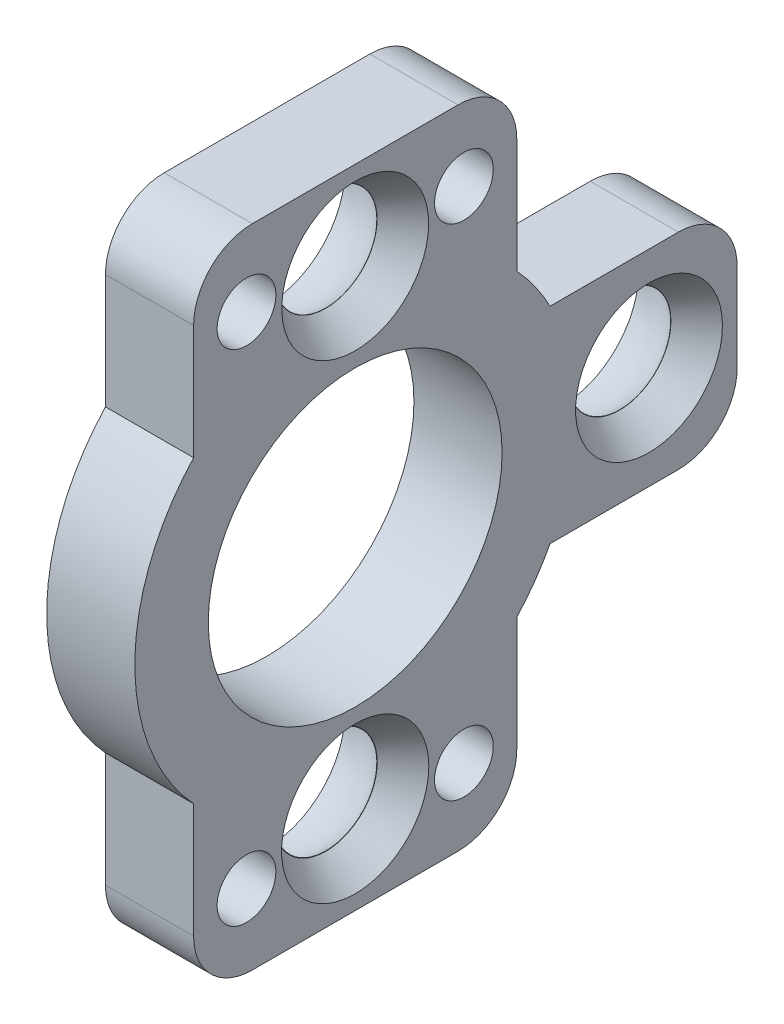
ISO-10303-21;
HEADER;
FILE_DESCRIPTION(('STEP AP214'),'2;1');
FILE_NAME('part.step','',(''),(''),'','','');
FILE_SCHEMA(('AUTOMOTIVE_DESIGN { 1 0 10303 214 1 1 1 1 }'));
ENDSEC;
DATA;
#1=APPLICATION_CONTEXT('core data for automotive mechanical design processes');
#2=APPLICATION_PROTOCOL_DEFINITION('international standard','automotive_design',2000,#1);
#3=PRODUCT_CONTEXT('',#1,'mechanical');
#4=PRODUCT('Part','Part','',(#3));
#5=PRODUCT_RELATED_PRODUCT_CATEGORY('part','',(#4));
#6=PRODUCT_DEFINITION_FORMATION('','',#4);
#7=PRODUCT_DEFINITION_CONTEXT('part definition',#1,'design');
#8=PRODUCT_DEFINITION('design','',#6,#7);
#9=PRODUCT_DEFINITION_SHAPE('','',#8);
#10=(LENGTH_UNIT() NAMED_UNIT(*) SI_UNIT(.MILLI.,.METRE.));
#11=(NAMED_UNIT(*) PLANE_ANGLE_UNIT() SI_UNIT($,.RADIAN.));
#12=(NAMED_UNIT(*) SI_UNIT($,.STERADIAN.) SOLID_ANGLE_UNIT());
#13=UNCERTAINTY_MEASURE_WITH_UNIT(LENGTH_MEASURE(1.E-05),#10,'distance_accuracy_value','');
#14=(GEOMETRIC_REPRESENTATION_CONTEXT(3) GLOBAL_UNCERTAINTY_ASSIGNED_CONTEXT((#13)) GLOBAL_UNIT_ASSIGNED_CONTEXT((#10,
#11,#12)) REPRESENTATION_CONTEXT('',''));
#15=CARTESIAN_POINT('',(0.,0.,0.));
#16=DIRECTION('',(0.,0.,1.));
#17=DIRECTION('',(1.,0.,0.));
#18=AXIS2_PLACEMENT_3D('',#15,#16,#17);
#19=CARTESIAN_POINT('',(0.,0.,-10.));
#20=DIRECTION('',(0.,0.,1.));
#21=DIRECTION('',(0.,-1.,0.));
#22=AXIS2_PLACEMENT_3D('',#19,#20,#21);
#23=SPHERICAL_SURFACE('',#22,2.65);
#24=CARTESIAN_POINT('',(0.,0.,-10.));
#25=DIRECTION('',(1.,0.,0.));
#26=DIRECTION('',(0.,0.,-1.));
#27=AXIS2_PLACEMENT_3D('',#24,#25,#26);
#28=SPHERICAL_SURFACE('',#27,2.65);
#29=CARTESIAN_POINT('',(0.,0.,-10.));
#30=DIRECTION('',(1.,0.,0.));
#31=DIRECTION('',(0.,0.,-1.));
#32=AXIS2_PLACEMENT_3D('',#29,#30,#31);
#33=CIRCLE('',#32,2.65);
#34=CARTESIAN_POINT('',(0.,0.,-12.65));
#35=VERTEX_POINT('',#34);
#36=EDGE_CURVE('E190',#35,#35,#33,.T.);
#37=ORIENTED_EDGE('',*,*,#36,.F.);
#38=EDGE_LOOP('',(#37));
#39=FACE_BOUND('',#38,.T.);
#40=CARTESIAN_POINT('',(2.,0.,-10.));
#41=DIRECTION('',(1.,0.,0.));
#42=DIRECTION('',(0.,0.,-1.));
#43=AXIS2_PLACEMENT_3D('',#40,#41,#42);
#44=CIRCLE('',#43,1.73853386507137);
#45=CARTESIAN_POINT('',(2.,0.,-11.7385338650714));
#46=VERTEX_POINT('',#45);
#47=EDGE_CURVE('E196',#46,#46,#44,.F.);
#48=ORIENTED_EDGE('',*,*,#47,.F.);
#49=EDGE_LOOP('',(#48));
#50=FACE_BOUND('',#49,.T.);
#51=ADVANCED_FACE('F35',(#39,#50),#28,.F.);
#52=CARTESIAN_POINT('',(3.,0.,0.));
#53=DIRECTION('',(-1.,0.,0.));
#54=DIRECTION('',(0.,0.,1.));
#55=AXIS2_PLACEMENT_3D('',#52,#53,#54);
#56=CYLINDRICAL_SURFACE('',#55,7.5);
#57=CARTESIAN_POINT('',(0.,0.,0.));
#58=DIRECTION('',(1.,0.,0.));
#59=DIRECTION('',(0.,0.,-1.));
#60=AXIS2_PLACEMENT_3D('',#57,#58,#59);
#61=CIRCLE('',#60,7.5);
#62=CARTESIAN_POINT('',(0.,-5.09901951359278,-5.5));
#63=VERTEX_POINT('',#62);
#64=CARTESIAN_POINT('',(0.,-3.5,-6.6332495807108));
#65=VERTEX_POINT('',#64);
#66=EDGE_CURVE('E171',#63,#65,#61,.T.);
#67=ORIENTED_EDGE('',*,*,#66,.T.);
#68=DIRECTION('',(-1.,0.,0.));
#69=VECTOR('',#68,1.);
#70=CARTESIAN_POINT('',(3.,-3.5,-6.6332495807108));
#71=LINE('',#70,#69);
#72=CARTESIAN_POINT('',(3.,-3.5,-6.6332495807108));
#73=VERTEX_POINT('',#72);
#74=EDGE_CURVE('E182',#65,#73,#71,.F.);
#75=ORIENTED_EDGE('',*,*,#74,.T.);
#76=CARTESIAN_POINT('',(3.,0.,0.));
#77=DIRECTION('',(1.,0.,0.));
#78=DIRECTION('',(0.,0.,-1.));
#79=AXIS2_PLACEMENT_3D('',#76,#77,#78);
#80=CIRCLE('',#79,7.5);
#81=CARTESIAN_POINT('',(3.,-5.09901951359278,-5.5));
#82=VERTEX_POINT('',#81);
#83=EDGE_CURVE('E282',#82,#73,#80,.T.);
#84=ORIENTED_EDGE('',*,*,#83,.F.);
#85=DIRECTION('',(-1.,0.,0.));
#86=VECTOR('',#85,1.);
#87=CARTESIAN_POINT('',(3.,-5.09901951359278,-5.5));
#88=LINE('',#87,#86);
#89=EDGE_CURVE('E292',#82,#63,#88,.T.);
#90=ORIENTED_EDGE('',*,*,#89,.T.);
#91=EDGE_LOOP('',(#67,#75,#84,#90));
#92=FACE_BOUND('',#91,.T.);
#93=ADVANCED_FACE('F373',(#92),#56,.T.);
#94=CARTESIAN_POINT('',(0.,-8.,0.));
#95=DIRECTION('',(0.,0.,1.));
#96=DIRECTION('',(0.,-1.,0.));
#97=AXIS2_PLACEMENT_3D('',#94,#95,#96);
#98=SPHERICAL_SURFACE('',#97,2.65);
#99=CARTESIAN_POINT('',(0.,-8.,0.));
#100=DIRECTION('',(1.,0.,0.));
#101=DIRECTION('',(0.,0.,-1.));
#102=AXIS2_PLACEMENT_3D('',#99,#100,#101);
#103=SPHERICAL_SURFACE('',#102,2.65);
#104=CARTESIAN_POINT('',(0.,-8.,0.));
#105=DIRECTION('',(1.,0.,0.));
#106=DIRECTION('',(0.,0.,-1.));
#107=AXIS2_PLACEMENT_3D('',#104,#105,#106);
#108=CIRCLE('',#107,2.65);
#109=CARTESIAN_POINT('',(0.,-8.,-2.65));
#110=VERTEX_POINT('',#109);
#111=EDGE_CURVE('E298',#110,#110,#108,.F.);
#112=ORIENTED_EDGE('',*,*,#111,.T.);
#113=EDGE_LOOP('',(#112));
#114=FACE_BOUND('',#113,.T.);
#115=CARTESIAN_POINT('',(2.,-8.,0.));
#116=DIRECTION('',(1.,0.,0.));
#117=DIRECTION('',(0.,0.,-1.));
#118=AXIS2_PLACEMENT_3D('',#115,#116,#117);
#119=CIRCLE('',#118,1.73853386507137);
#120=CARTESIAN_POINT('',(2.,-8.,-1.73853386507137));
#121=VERTEX_POINT('',#120);
#122=EDGE_CURVE('E235',#121,#121,#119,.T.);
#123=ORIENTED_EDGE('',*,*,#122,.T.);
#124=EDGE_LOOP('',(#123));
#125=FACE_BOUND('',#124,.T.);
#126=ADVANCED_FACE('F436',(#114,#125),#103,.F.);
#127=CARTESIAN_POINT('',(0.,8.,0.));
#128=DIRECTION('',(0.,0.,-1.));
#129=DIRECTION('',(0.,1.,0.));
#130=AXIS2_PLACEMENT_3D('',#127,#128,#129);
#131=SPHERICAL_SURFACE('',#130,2.65);
#132=CARTESIAN_POINT('',(0.,8.,0.));
#133=DIRECTION('',(1.,0.,0.));
#134=DIRECTION('',(0.,0.,-1.));
#135=AXIS2_PLACEMENT_3D('',#132,#133,#134);
#136=SPHERICAL_SURFACE('',#135,2.65);
#137=CARTESIAN_POINT('',(0.,8.,0.));
#138=DIRECTION('',(1.,0.,0.));
#139=DIRECTION('',(0.,0.,-1.));
#140=AXIS2_PLACEMENT_3D('',#137,#138,#139);
#141=CIRCLE('',#140,2.65);
#142=CARTESIAN_POINT('',(0.,8.,-2.65));
#143=VERTEX_POINT('',#142);
#144=EDGE_CURVE('E256',#143,#143,#141,.T.);
#145=ORIENTED_EDGE('',*,*,#144,.F.);
#146=EDGE_LOOP('',(#145));
#147=FACE_BOUND('',#146,.T.);
#148=CARTESIAN_POINT('',(2.,8.,0.));
#149=DIRECTION('',(1.,0.,0.));
#150=DIRECTION('',(0.,0.,-1.));
#151=AXIS2_PLACEMENT_3D('',#148,#149,#150);
#152=CIRCLE('',#151,1.73853386507137);
#153=CARTESIAN_POINT('',(2.,8.,-1.73853386507137));
#154=VERTEX_POINT('',#153);
#155=EDGE_CURVE('E242',#154,#154,#152,.F.);
#156=ORIENTED_EDGE('',*,*,#155,.F.);
#157=EDGE_LOOP('',(#156));
#158=FACE_BOUND('',#157,.T.);
#159=ADVANCED_FACE('F485',(#147,#158),#136,.F.);
#160=CARTESIAN_POINT('',(3.,3.5,-6.6332495807108));
#161=VERTEX_POINT('',#160);
#162=CARTESIAN_POINT('',(3.,5.09901951359279,-5.5));
#163=VERTEX_POINT('',#162);
#164=EDGE_CURVE('E178',#161,#163,#80,.T.);
#165=ORIENTED_EDGE('',*,*,#164,.F.);
#166=DIRECTION('',(-1.,0.,0.));
#167=VECTOR('',#166,1.);
#168=CARTESIAN_POINT('',(3.,3.5,-6.6332495807108));
#169=LINE('',#168,#167);
#170=CARTESIAN_POINT('',(0.,3.5,-6.6332495807108));
#171=VERTEX_POINT('',#170);
#172=EDGE_CURVE('E176',#161,#171,#169,.T.);
#173=ORIENTED_EDGE('',*,*,#172,.T.);
#174=CARTESIAN_POINT('',(0.,5.09901951359279,-5.5));
#175=VERTEX_POINT('',#174);
#176=EDGE_CURVE('E160',#171,#175,#61,.T.);
#177=ORIENTED_EDGE('',*,*,#176,.T.);
#178=DIRECTION('',(-1.,0.,0.));
#179=VECTOR('',#178,1.);
#180=CARTESIAN_POINT('',(3.,5.09901951359279,-5.5));
#181=LINE('',#180,#179);
#182=EDGE_CURVE('E281',#175,#163,#181,.F.);
#183=ORIENTED_EDGE('',*,*,#182,.T.);
#184=EDGE_LOOP('',(#165,#173,#177,#183));
#185=FACE_BOUND('',#184,.T.);
#186=ADVANCED_FACE('F177',(#185),#56,.T.);
#187=CARTESIAN_POINT('',(3.,0.,0.));
#188=DIRECTION('',(1.,0.,0.));
#189=DIRECTION('',(0.,0.,-1.));
#190=AXIS2_PLACEMENT_3D('',#187,#188,#189);
#191=PLANE('',#190);
#192=CARTESIAN_POINT('',(3.,0.,-10.));
#193=DIRECTION('',(1.,0.,0.));
#194=DIRECTION('',(0.,0.,-1.));
#195=AXIS2_PLACEMENT_3D('',#192,#193,#194);
#196=CIRCLE('',#195,2.5);
#197=CARTESIAN_POINT('',(3.,0.,-12.5));
#198=VERTEX_POINT('',#197);
#199=EDGE_CURVE('E746',#198,#198,#196,.T.);
#200=ORIENTED_EDGE('',*,*,#199,.F.);
#201=EDGE_LOOP('',(#200));
#202=FACE_BOUND('',#201,.T.);
#203=DIRECTION('',(0.,-1.,0.));
#204=VECTOR('',#203,1.);
#205=CARTESIAN_POINT('',(3.,3.5,-13.));
#206=LINE('',#205,#204);
#207=CARTESIAN_POINT('',(3.,1.5,-13.));
#208=VERTEX_POINT('',#207);
#209=CARTESIAN_POINT('',(3.,-1.5,-13.));
#210=VERTEX_POINT('',#209);
#211=EDGE_CURVE('E356',#208,#210,#206,.T.);
#212=ORIENTED_EDGE('',*,*,#211,.F.);
#213=CARTESIAN_POINT('',(3.,1.5,-11.));
#214=DIRECTION('',(1.,0.,0.));
#215=DIRECTION('',(0.,0.,-1.));
#216=AXIS2_PLACEMENT_3D('',#213,#214,#215);
#217=CIRCLE('',#216,2.);
#218=CARTESIAN_POINT('',(3.,3.5,-11.));
#219=VERTEX_POINT('',#218);
#220=EDGE_CURVE('E43',#208,#219,#217,.T.);
#221=ORIENTED_EDGE('',*,*,#220,.T.);
#222=DIRECTION('',(0.,0.,-1.));
#223=VECTOR('',#222,1.);
#224=CARTESIAN_POINT('',(3.,3.5,-5.5));
#225=LINE('',#224,#223);
#226=EDGE_CURVE('E201',#161,#219,#225,.T.);
#227=ORIENTED_EDGE('',*,*,#226,.F.);
#228=ORIENTED_EDGE('',*,*,#164,.T.);
#229=DIRECTION('',(0.,1.,0.));
#230=VECTOR('',#229,1.);
#231=CARTESIAN_POINT('',(3.,11.,-5.5));
#232=LINE('',#231,#230);
#233=CARTESIAN_POINT('',(3.,9.,-5.5));
#234=VERTEX_POINT('',#233);
#235=EDGE_CURVE('E270',#163,#234,#232,.T.);
#236=ORIENTED_EDGE('',*,*,#235,.T.);
#237=CARTESIAN_POINT('',(3.,9.,-3.5));
#238=DIRECTION('',(1.,0.,0.));
#239=DIRECTION('',(0.,0.,-1.));
#240=AXIS2_PLACEMENT_3D('',#237,#238,#239);
#241=CIRCLE('',#240,2.);
#242=CARTESIAN_POINT('',(3.,11.,-3.5));
#243=VERTEX_POINT('',#242);
#244=EDGE_CURVE('E313',#234,#243,#241,.T.);
#245=ORIENTED_EDGE('',*,*,#244,.T.);
#246=DIRECTION('',(0.,0.,1.));
#247=VECTOR('',#246,1.);
#248=CARTESIAN_POINT('',(3.,11.,5.5));
#249=LINE('',#248,#247);
#250=CARTESIAN_POINT('',(3.,11.,3.5));
#251=VERTEX_POINT('',#250);
#252=EDGE_CURVE('E263',#243,#251,#249,.T.);
#253=ORIENTED_EDGE('',*,*,#252,.T.);
#254=CARTESIAN_POINT('',(3.,9.,3.5));
#255=DIRECTION('',(1.,0.,0.));
#256=DIRECTION('',(0.,0.,-1.));
#257=AXIS2_PLACEMENT_3D('',#254,#255,#256);
#258=CIRCLE('',#257,2.);
#259=CARTESIAN_POINT('',(3.,9.,5.5));
#260=VERTEX_POINT('',#259);
#261=EDGE_CURVE('E315',#251,#260,#258,.T.);
#262=ORIENTED_EDGE('',*,*,#261,.T.);
#263=DIRECTION('',(0.,-1.,0.));
#264=VECTOR('',#263,1.);
#265=CARTESIAN_POINT('',(3.,11.,5.5));
#266=LINE('',#265,#264);
#267=CARTESIAN_POINT('',(3.,5.09901951359278,5.5));
#268=VERTEX_POINT('',#267);
#269=EDGE_CURVE('E252',#260,#268,#266,.T.);
#270=ORIENTED_EDGE('',*,*,#269,.T.);
#271=CARTESIAN_POINT('',(3.,-5.09901951359278,5.5));
#272=VERTEX_POINT('',#271);
#273=EDGE_CURVE('E279',#268,#272,#80,.T.);
#274=ORIENTED_EDGE('',*,*,#273,.T.);
#275=DIRECTION('',(0.,-1.,0.));
#276=VECTOR('',#275,1.);
#277=CARTESIAN_POINT('',(3.,-11.,5.5));
#278=LINE('',#277,#276);
#279=CARTESIAN_POINT('',(3.,-9.,5.5));
#280=VERTEX_POINT('',#279);
#281=EDGE_CURVE('E255',#272,#280,#278,.T.);
#282=ORIENTED_EDGE('',*,*,#281,.T.);
#283=CARTESIAN_POINT('',(3.,-9.,3.5));
#284=DIRECTION('',(1.,0.,0.));
#285=DIRECTION('',(0.,0.,-1.));
#286=AXIS2_PLACEMENT_3D('',#283,#284,#285);
#287=CIRCLE('',#286,2.);
#288=CARTESIAN_POINT('',(3.,-11.,3.5));
#289=VERTEX_POINT('',#288);
#290=EDGE_CURVE('E311',#280,#289,#287,.T.);
#291=ORIENTED_EDGE('',*,*,#290,.T.);
#292=DIRECTION('',(0.,0.,-1.));
#293=VECTOR('',#292,1.);
#294=CARTESIAN_POINT('',(3.,-11.,-5.5));
#295=LINE('',#294,#293);
#296=CARTESIAN_POINT('',(3.,-11.,-3.5));
#297=VERTEX_POINT('',#296);
#298=EDGE_CURVE('E246',#289,#297,#295,.T.);
#299=ORIENTED_EDGE('',*,*,#298,.T.);
#300=CARTESIAN_POINT('',(3.,-9.,-3.5));
#301=DIRECTION('',(1.,0.,0.));
#302=DIRECTION('',(0.,0.,-1.));
#303=AXIS2_PLACEMENT_3D('',#300,#301,#302);
#304=CIRCLE('',#303,2.);
#305=CARTESIAN_POINT('',(3.,-9.,-5.5));
#306=VERTEX_POINT('',#305);
#307=EDGE_CURVE('E309',#297,#306,#304,.T.);
#308=ORIENTED_EDGE('',*,*,#307,.T.);
#309=DIRECTION('',(0.,1.,0.));
#310=VECTOR('',#309,1.);
#311=CARTESIAN_POINT('',(3.,-11.,-5.5));
#312=LINE('',#311,#310);
#313=EDGE_CURVE('E253',#306,#82,#312,.T.);
#314=ORIENTED_EDGE('',*,*,#313,.T.);
#315=ORIENTED_EDGE('',*,*,#83,.T.);
#316=DIRECTION('',(0.,0.,1.));
#317=VECTOR('',#316,1.);
#318=CARTESIAN_POINT('',(3.,-3.5,-5.5));
#319=LINE('',#318,#317);
#320=CARTESIAN_POINT('',(3.,-3.5,-11.));
#321=VERTEX_POINT('',#320);
#322=EDGE_CURVE('E183',#321,#73,#319,.T.);
#323=ORIENTED_EDGE('',*,*,#322,.F.);
#324=CARTESIAN_POINT('',(3.,-1.5,-11.));
#325=DIRECTION('',(1.,0.,0.));
#326=DIRECTION('',(0.,0.,-1.));
#327=AXIS2_PLACEMENT_3D('',#324,#325,#326);
#328=CIRCLE('',#327,2.);
#329=EDGE_CURVE('E55',#321,#210,#328,.T.);
#330=ORIENTED_EDGE('',*,*,#329,.T.);
#331=EDGE_LOOP('',(#212,#221,#227,#228,#236,#245,#253,#262,#270,#274,#282,#291,#299,#308,#314,
#315,#323,#330));
#332=FACE_BOUND('',#331,.T.);
#333=CARTESIAN_POINT('',(3.,-8.5,-3.7));
#334=DIRECTION('',(1.,0.,0.));
#335=DIRECTION('',(0.,0.,1.));
#336=AXIS2_PLACEMENT_3D('',#333,#334,#335);
#337=CIRCLE('',#336,1.);
#338=CARTESIAN_POINT('',(3.,-8.5,-2.7));
#339=VERTEX_POINT('',#338);
#340=EDGE_CURVE('E210',#339,#339,#337,.T.);
#341=ORIENTED_EDGE('',*,*,#340,.F.);
#342=EDGE_LOOP('',(#341));
#343=FACE_BOUND('',#342,.T.);
#344=CARTESIAN_POINT('',(3.,8.5,-3.7));
#345=DIRECTION('',(1.,0.,0.));
#346=DIRECTION('',(0.,0.,-1.));
#347=AXIS2_PLACEMENT_3D('',#344,#345,#346);
#348=CIRCLE('',#347,1.);
#349=CARTESIAN_POINT('',(3.,8.5,-4.7));
#350=VERTEX_POINT('',#349);
#351=EDGE_CURVE('E216',#350,#350,#348,.T.);
#352=ORIENTED_EDGE('',*,*,#351,.F.);
#353=EDGE_LOOP('',(#352));
#354=FACE_BOUND('',#353,.T.);
#355=CARTESIAN_POINT('',(3.,8.5,3.7));
#356=DIRECTION('',(1.,0.,0.));
#357=DIRECTION('',(0.,0.,1.));
#358=AXIS2_PLACEMENT_3D('',#355,#356,#357);
#359=CIRCLE('',#358,1.);
#360=CARTESIAN_POINT('',(3.,8.5,4.7));
#361=VERTEX_POINT('',#360);
#362=EDGE_CURVE('E205',#361,#361,#359,.T.);
#363=ORIENTED_EDGE('',*,*,#362,.F.);
#364=EDGE_LOOP('',(#363));
#365=FACE_BOUND('',#364,.T.);
#366=CARTESIAN_POINT('',(3.,-8.5,3.7));
#367=DIRECTION('',(1.,0.,0.));
#368=DIRECTION('',(0.,0.,-1.));
#369=AXIS2_PLACEMENT_3D('',#366,#367,#368);
#370=CIRCLE('',#369,1.);
#371=CARTESIAN_POINT('',(3.,-8.5,2.7));
#372=VERTEX_POINT('',#371);
#373=EDGE_CURVE('E209',#372,#372,#370,.T.);
#374=ORIENTED_EDGE('',*,*,#373,.F.);
#375=EDGE_LOOP('',(#374));
#376=FACE_BOUND('',#375,.T.);
#377=CARTESIAN_POINT('',(3.,-8.,0.));
#378=DIRECTION('',(1.,0.,0.));
#379=DIRECTION('',(0.,0.,-1.));
#380=AXIS2_PLACEMENT_3D('',#377,#378,#379);
#381=CIRCLE('',#380,2.50559232722158);
#382=CARTESIAN_POINT('',(3.,-8.,-2.50559232722158));
#383=VERTEX_POINT('',#382);
#384=EDGE_CURVE('E227',#383,#383,#381,.T.);
#385=ORIENTED_EDGE('',*,*,#384,.F.);
#386=EDGE_LOOP('',(#385));
#387=FACE_BOUND('',#386,.T.);
#388=CARTESIAN_POINT('',(3.,8.,0.));
#389=DIRECTION('',(1.,0.,0.));
#390=DIRECTION('',(0.,0.,-1.));
#391=AXIS2_PLACEMENT_3D('',#388,#389,#390);
#392=CIRCLE('',#391,2.5);
#393=CARTESIAN_POINT('',(3.,8.,-2.5));
#394=VERTEX_POINT('',#393);
#395=EDGE_CURVE('E236',#394,#394,#392,.T.);
#396=ORIENTED_EDGE('',*,*,#395,.F.);
#397=EDGE_LOOP('',(#396));
#398=FACE_BOUND('',#397,.T.);
#399=CARTESIAN_POINT('',(3.,0.,0.));
#400=DIRECTION('',(1.,0.,0.));
#401=DIRECTION('',(0.,0.,-1.));
#402=AXIS2_PLACEMENT_3D('',#399,#400,#401);
#403=CIRCLE('',#402,5.);
#404=CARTESIAN_POINT('',(3.,0.,-5.));
#405=VERTEX_POINT('',#404);
#406=EDGE_CURVE('E172',#405,#405,#403,.T.);
#407=ORIENTED_EDGE('',*,*,#406,.F.);
#408=EDGE_LOOP('',(#407));
#409=FACE_BOUND('',#408,.T.);
#410=ADVANCED_FACE('F354',(#202,#332,#343,#354,#365,#376,#387,#398,#409),#191,.T.);
#411=CARTESIAN_POINT('',(0.,0.,0.));
#412=DIRECTION('',(1.,0.,0.));
#413=DIRECTION('',(0.,0.,-1.));
#414=AXIS2_PLACEMENT_3D('',#411,#412,#413);
#415=PLANE('',#414);
#416=ORIENTED_EDGE('',*,*,#36,.T.);
#417=EDGE_LOOP('',(#416));
#418=FACE_BOUND('',#417,.T.);
#419=DIRECTION('',(0.,0.,-1.));
#420=VECTOR('',#419,1.);
#421=CARTESIAN_POINT('',(0.,3.5,-5.5));
#422=LINE('',#421,#420);
#423=CARTESIAN_POINT('',(0.,3.5,-11.));
#424=VERTEX_POINT('',#423);
#425=EDGE_CURVE('E165',#171,#424,#422,.T.);
#426=ORIENTED_EDGE('',*,*,#425,.T.);
#427=CARTESIAN_POINT('',(0.,1.5,-11.));
#428=DIRECTION('',(1.,0.,0.));
#429=DIRECTION('',(0.,0.,-1.));
#430=AXIS2_PLACEMENT_3D('',#427,#428,#429);
#431=CIRCLE('',#430,2.);
#432=CARTESIAN_POINT('',(0.,1.5,-13.));
#433=VERTEX_POINT('',#432);
#434=EDGE_CURVE('E346',#424,#433,#431,.F.);
#435=ORIENTED_EDGE('',*,*,#434,.T.);
#436=DIRECTION('',(0.,-1.,0.));
#437=VECTOR('',#436,1.);
#438=CARTESIAN_POINT('',(0.,3.5,-13.));
#439=LINE('',#438,#437);
#440=CARTESIAN_POINT('',(0.,-1.5,-13.));
#441=VERTEX_POINT('',#440);
#442=EDGE_CURVE('E189',#433,#441,#439,.T.);
#443=ORIENTED_EDGE('',*,*,#442,.T.);
#444=CARTESIAN_POINT('',(0.,-1.5,-11.));
#445=DIRECTION('',(1.,0.,0.));
#446=DIRECTION('',(0.,0.,-1.));
#447=AXIS2_PLACEMENT_3D('',#444,#445,#446);
#448=CIRCLE('',#447,2.);
#449=CARTESIAN_POINT('',(0.,-3.5,-11.));
#450=VERTEX_POINT('',#449);
#451=EDGE_CURVE('E344',#441,#450,#448,.F.);
#452=ORIENTED_EDGE('',*,*,#451,.T.);
#453=DIRECTION('',(0.,0.,1.));
#454=VECTOR('',#453,1.);
#455=CARTESIAN_POINT('',(0.,-3.5,-5.5));
#456=LINE('',#455,#454);
#457=EDGE_CURVE('E193',#450,#65,#456,.T.);
#458=ORIENTED_EDGE('',*,*,#457,.T.);
#459=ORIENTED_EDGE('',*,*,#66,.F.);
#460=DIRECTION('',(0.,1.,0.));
#461=VECTOR('',#460,1.);
#462=CARTESIAN_POINT('',(0.,-11.,-5.5));
#463=LINE('',#462,#461);
#464=CARTESIAN_POINT('',(0.,-9.,-5.5));
#465=VERTEX_POINT('',#464);
#466=EDGE_CURVE('E243',#465,#63,#463,.T.);
#467=ORIENTED_EDGE('',*,*,#466,.F.);
#468=CARTESIAN_POINT('',(0.,-9.,-3.5));
#469=DIRECTION('',(1.,0.,0.));
#470=DIRECTION('',(0.,0.,-1.));
#471=AXIS2_PLACEMENT_3D('',#468,#469,#470);
#472=CIRCLE('',#471,2.);
#473=CARTESIAN_POINT('',(0.,-11.,-3.5));
#474=VERTEX_POINT('',#473);
#475=EDGE_CURVE('E319',#465,#474,#472,.F.);
#476=ORIENTED_EDGE('',*,*,#475,.T.);
#477=DIRECTION('',(0.,0.,-1.));
#478=VECTOR('',#477,1.);
#479=CARTESIAN_POINT('',(0.,-11.,-5.5));
#480=LINE('',#479,#478);
#481=CARTESIAN_POINT('',(0.,-11.,3.5));
#482=VERTEX_POINT('',#481);
#483=EDGE_CURVE('E249',#482,#474,#480,.T.);
#484=ORIENTED_EDGE('',*,*,#483,.F.);
#485=CARTESIAN_POINT('',(0.,-9.,3.5));
#486=DIRECTION('',(1.,0.,0.));
#487=DIRECTION('',(0.,0.,-1.));
#488=AXIS2_PLACEMENT_3D('',#485,#486,#487);
#489=CIRCLE('',#488,2.);
#490=CARTESIAN_POINT('',(0.,-9.,5.5));
#491=VERTEX_POINT('',#490);
#492=EDGE_CURVE('E321',#482,#491,#489,.F.);
#493=ORIENTED_EDGE('',*,*,#492,.T.);
#494=DIRECTION('',(0.,-1.,0.));
#495=VECTOR('',#494,1.);
#496=CARTESIAN_POINT('',(0.,-11.,5.5));
#497=LINE('',#496,#495);
#498=CARTESIAN_POINT('',(0.,-5.09901951359278,5.5));
#499=VERTEX_POINT('',#498);
#500=EDGE_CURVE('E245',#499,#491,#497,.T.);
#501=ORIENTED_EDGE('',*,*,#500,.F.);
#502=CARTESIAN_POINT('',(0.,5.09901951359278,5.5));
#503=VERTEX_POINT('',#502);
#504=EDGE_CURVE('E174',#503,#499,#61,.T.);
#505=ORIENTED_EDGE('',*,*,#504,.F.);
#506=DIRECTION('',(0.,-1.,0.));
#507=VECTOR('',#506,1.);
#508=CARTESIAN_POINT('',(0.,11.,5.5));
#509=LINE('',#508,#507);
#510=CARTESIAN_POINT('',(0.,9.,5.5));
#511=VERTEX_POINT('',#510);
#512=EDGE_CURVE('E261',#511,#503,#509,.T.);
#513=ORIENTED_EDGE('',*,*,#512,.F.);
#514=CARTESIAN_POINT('',(0.,9.,3.5));
#515=DIRECTION('',(1.,0.,0.));
#516=DIRECTION('',(0.,0.,-1.));
#517=AXIS2_PLACEMENT_3D('',#514,#515,#516);
#518=CIRCLE('',#517,2.);
#519=CARTESIAN_POINT('',(0.,11.,3.5));
#520=VERTEX_POINT('',#519);
#521=EDGE_CURVE('E325',#511,#520,#518,.F.);
#522=ORIENTED_EDGE('',*,*,#521,.T.);
#523=DIRECTION('',(0.,0.,1.));
#524=VECTOR('',#523,1.);
#525=CARTESIAN_POINT('',(0.,11.,5.5));
#526=LINE('',#525,#524);
#527=CARTESIAN_POINT('',(0.,11.,-3.5));
#528=VERTEX_POINT('',#527);
#529=EDGE_CURVE('E265',#528,#520,#526,.T.);
#530=ORIENTED_EDGE('',*,*,#529,.F.);
#531=CARTESIAN_POINT('',(0.,9.,-3.5));
#532=DIRECTION('',(1.,0.,0.));
#533=DIRECTION('',(0.,0.,-1.));
#534=AXIS2_PLACEMENT_3D('',#531,#532,#533);
#535=CIRCLE('',#534,2.);
#536=CARTESIAN_POINT('',(0.,9.,-5.5));
#537=VERTEX_POINT('',#536);
#538=EDGE_CURVE('E323',#528,#537,#535,.F.);
#539=ORIENTED_EDGE('',*,*,#538,.T.);
#540=DIRECTION('',(0.,1.,0.));
#541=VECTOR('',#540,1.);
#542=CARTESIAN_POINT('',(0.,11.,-5.5));
#543=LINE('',#542,#541);
#544=EDGE_CURVE('E167',#175,#537,#543,.T.);
#545=ORIENTED_EDGE('',*,*,#544,.F.);
#546=ORIENTED_EDGE('',*,*,#176,.F.);
#547=EDGE_LOOP('',(#426,#435,#443,#452,#458,#459,#467,#476,#484,#493,#501,#505,#513,#522,#530,
#539,#545,#546));
#548=FACE_BOUND('',#547,.T.);
#549=CARTESIAN_POINT('',(0.,-8.5,-3.7));
#550=DIRECTION('',(1.,0.,0.));
#551=DIRECTION('',(0.,0.,1.));
#552=AXIS2_PLACEMENT_3D('',#549,#550,#551);
#553=CIRCLE('',#552,1.);
#554=CARTESIAN_POINT('',(0.,-8.5,-2.7));
#555=VERTEX_POINT('',#554);
#556=EDGE_CURVE('E206',#555,#555,#553,.T.);
#557=ORIENTED_EDGE('',*,*,#556,.T.);
#558=EDGE_LOOP('',(#557));
#559=FACE_BOUND('',#558,.T.);
#560=CARTESIAN_POINT('',(0.,8.5,-3.7));
#561=DIRECTION('',(1.,0.,0.));
#562=DIRECTION('',(0.,0.,-1.));
#563=AXIS2_PLACEMENT_3D('',#560,#561,#562);
#564=CIRCLE('',#563,1.);
#565=CARTESIAN_POINT('',(0.,8.5,-4.7));
#566=VERTEX_POINT('',#565);
#567=EDGE_CURVE('E213',#566,#566,#564,.T.);
#568=ORIENTED_EDGE('',*,*,#567,.T.);
#569=EDGE_LOOP('',(#568));
#570=FACE_BOUND('',#569,.T.);
#571=CARTESIAN_POINT('',(0.,8.5,3.7));
#572=DIRECTION('',(1.,0.,0.));
#573=DIRECTION('',(0.,0.,1.));
#574=AXIS2_PLACEMENT_3D('',#571,#572,#573);
#575=CIRCLE('',#574,1.);
#576=CARTESIAN_POINT('',(0.,8.5,4.7));
#577=VERTEX_POINT('',#576);
#578=EDGE_CURVE('E219',#577,#577,#575,.T.);
#579=ORIENTED_EDGE('',*,*,#578,.T.);
#580=EDGE_LOOP('',(#579));
#581=FACE_BOUND('',#580,.T.);
#582=CARTESIAN_POINT('',(0.,-8.5,3.7));
#583=DIRECTION('',(1.,0.,0.));
#584=DIRECTION('',(0.,0.,-1.));
#585=AXIS2_PLACEMENT_3D('',#582,#583,#584);
#586=CIRCLE('',#585,1.);
#587=CARTESIAN_POINT('',(0.,-8.5,2.7));
#588=VERTEX_POINT('',#587);
#589=EDGE_CURVE('E224',#588,#588,#586,.T.);
#590=ORIENTED_EDGE('',*,*,#589,.T.);
#591=EDGE_LOOP('',(#590));
#592=FACE_BOUND('',#591,.T.);
#593=ORIENTED_EDGE('',*,*,#111,.F.);
#594=EDGE_LOOP('',(#593));
#595=FACE_BOUND('',#594,.T.);
#596=ORIENTED_EDGE('',*,*,#144,.T.);
#597=EDGE_LOOP('',(#596));
#598=FACE_BOUND('',#597,.T.);
#599=CARTESIAN_POINT('',(0.,0.,0.));
#600=DIRECTION('',(1.,0.,0.));
#601=DIRECTION('',(0.,0.,-1.));
#602=AXIS2_PLACEMENT_3D('',#599,#600,#601);
#603=CIRCLE('',#602,5.);
#604=CARTESIAN_POINT('',(0.,0.,-5.));
#605=VERTEX_POINT('',#604);
#606=EDGE_CURVE('E268',#605,#605,#603,.T.);
#607=ORIENTED_EDGE('',*,*,#606,.T.);
#608=EDGE_LOOP('',(#607));
#609=FACE_BOUND('',#608,.T.);
#610=ADVANCED_FACE('F162',(#418,#548,#559,#570,#581,#592,#595,#598,#609),#415,.F.);
#611=ORIENTED_EDGE('',*,*,#504,.T.);
#612=DIRECTION('',(-1.,0.,0.));
#613=VECTOR('',#612,1.);
#614=CARTESIAN_POINT('',(3.,-5.09901951359278,5.5));
#615=LINE('',#614,#613);
#616=EDGE_CURVE('E289',#499,#272,#615,.F.);
#617=ORIENTED_EDGE('',*,*,#616,.T.);
#618=ORIENTED_EDGE('',*,*,#273,.F.);
#619=DIRECTION('',(-1.,0.,0.));
#620=VECTOR('',#619,1.);
#621=CARTESIAN_POINT('',(3.,5.09901951359278,5.5));
#622=LINE('',#621,#620);
#623=EDGE_CURVE('E286',#268,#503,#622,.T.);
#624=ORIENTED_EDGE('',*,*,#623,.T.);
#625=EDGE_LOOP('',(#611,#617,#618,#624));
#626=FACE_BOUND('',#625,.T.);
#627=ADVANCED_FACE('F401',(#626),#56,.T.);
#628=CARTESIAN_POINT('',(3.,0.,0.));
#629=DIRECTION('',(-1.,0.,0.));
#630=DIRECTION('',(0.,0.,1.));
#631=AXIS2_PLACEMENT_3D('',#628,#629,#630);
#632=CYLINDRICAL_SURFACE('',#631,5.);
#633=ORIENTED_EDGE('',*,*,#606,.F.);
#634=EDGE_LOOP('',(#633));
#635=FACE_BOUND('',#634,.T.);
#636=ORIENTED_EDGE('',*,*,#406,.T.);
#637=EDGE_LOOP('',(#636));
#638=FACE_BOUND('',#637,.T.);
#639=ADVANCED_FACE('F697',(#635,#638),#632,.F.);
#640=CARTESIAN_POINT('',(0.,11.,5.5));
#641=DIRECTION('',(0.,0.,1.));
#642=DIRECTION('',(0.,-1.,0.));
#643=AXIS2_PLACEMENT_3D('',#640,#641,#642);
#644=PLANE('',#643);
#645=ORIENTED_EDGE('',*,*,#269,.F.);
#646=DIRECTION('',(1.,0.,0.));
#647=VECTOR('',#646,1.);
#648=CARTESIAN_POINT('',(0.,9.,5.5));
#649=LINE('',#648,#647);
#650=EDGE_CURVE('E317',#260,#511,#649,.F.);
#651=ORIENTED_EDGE('',*,*,#650,.T.);
#652=ORIENTED_EDGE('',*,*,#512,.T.);
#653=ORIENTED_EDGE('',*,*,#623,.F.);
#654=EDGE_LOOP('',(#645,#651,#652,#653));
#655=FACE_BOUND('',#654,.T.);
#656=ADVANCED_FACE('F396',(#655),#644,.T.);
#657=CARTESIAN_POINT('',(0.,11.,-5.5));
#658=DIRECTION('',(0.,0.,-1.));
#659=DIRECTION('',(-1.,0.,0.));
#660=AXIS2_PLACEMENT_3D('',#657,#658,#659);
#661=PLANE('',#660);
#662=ORIENTED_EDGE('',*,*,#544,.T.);
#663=DIRECTION('',(1.,0.,0.));
#664=VECTOR('',#663,1.);
#665=CARTESIAN_POINT('',(0.,9.,-5.5));
#666=LINE('',#665,#664);
#667=EDGE_CURVE('E327',#537,#234,#666,.T.);
#668=ORIENTED_EDGE('',*,*,#667,.T.);
#669=ORIENTED_EDGE('',*,*,#235,.F.);
#670=ORIENTED_EDGE('',*,*,#182,.F.);
#671=EDGE_LOOP('',(#662,#668,#669,#670));
#672=FACE_BOUND('',#671,.T.);
#673=ADVANCED_FACE('F378',(#672),#661,.T.);
#674=CARTESIAN_POINT('',(0.,11.,5.5));
#675=DIRECTION('',(0.,1.,0.));
#676=DIRECTION('',(0.,0.,1.));
#677=AXIS2_PLACEMENT_3D('',#674,#675,#676);
#678=PLANE('',#677);
#679=ORIENTED_EDGE('',*,*,#529,.T.);
#680=DIRECTION('',(1.,0.,0.));
#681=VECTOR('',#680,1.);
#682=CARTESIAN_POINT('',(0.,11.,3.5));
#683=LINE('',#682,#681);
#684=EDGE_CURVE('E306',#520,#251,#683,.T.);
#685=ORIENTED_EDGE('',*,*,#684,.T.);
#686=ORIENTED_EDGE('',*,*,#252,.F.);
#687=DIRECTION('',(1.,0.,0.));
#688=VECTOR('',#687,1.);
#689=CARTESIAN_POINT('',(0.,11.,-3.5));
#690=LINE('',#689,#688);
#691=EDGE_CURVE('E295',#243,#528,#690,.F.);
#692=ORIENTED_EDGE('',*,*,#691,.T.);
#693=EDGE_LOOP('',(#679,#685,#686,#692));
#694=FACE_BOUND('',#693,.T.);
#695=ADVANCED_FACE('F386',(#694),#678,.T.);
#696=CARTESIAN_POINT('',(0.,-11.,-5.5));
#697=DIRECTION('',(0.,0.,-1.));
#698=DIRECTION('',(-1.,0.,0.));
#699=AXIS2_PLACEMENT_3D('',#696,#697,#698);
#700=PLANE('',#699);
#701=ORIENTED_EDGE('',*,*,#313,.F.);
#702=DIRECTION('',(1.,0.,0.));
#703=VECTOR('',#702,1.);
#704=CARTESIAN_POINT('',(0.,-9.,-5.5));
#705=LINE('',#704,#703);
#706=EDGE_CURVE('E338',#306,#465,#705,.F.);
#707=ORIENTED_EDGE('',*,*,#706,.T.);
#708=ORIENTED_EDGE('',*,*,#466,.T.);
#709=ORIENTED_EDGE('',*,*,#89,.F.);
#710=EDGE_LOOP('',(#701,#707,#708,#709));
#711=FACE_BOUND('',#710,.T.);
#712=ADVANCED_FACE('F421',(#711),#700,.T.);
#713=CARTESIAN_POINT('',(0.,-11.,5.5));
#714=DIRECTION('',(0.,0.,1.));
#715=DIRECTION('',(1.,0.,0.));
#716=AXIS2_PLACEMENT_3D('',#713,#714,#715);
#717=PLANE('',#716);
#718=ORIENTED_EDGE('',*,*,#500,.T.);
#719=DIRECTION('',(1.,0.,0.));
#720=VECTOR('',#719,1.);
#721=CARTESIAN_POINT('',(0.,-9.,5.5));
#722=LINE('',#721,#720);
#723=EDGE_CURVE('E330',#491,#280,#722,.T.);
#724=ORIENTED_EDGE('',*,*,#723,.T.);
#725=ORIENTED_EDGE('',*,*,#281,.F.);
#726=ORIENTED_EDGE('',*,*,#616,.F.);
#727=EDGE_LOOP('',(#718,#724,#725,#726));
#728=FACE_BOUND('',#727,.T.);
#729=ADVANCED_FACE('F404',(#728),#717,.T.);
#730=CARTESIAN_POINT('',(0.,-11.,-5.5));
#731=DIRECTION('',(0.,-1.,0.));
#732=DIRECTION('',(0.,0.,-1.));
#733=AXIS2_PLACEMENT_3D('',#730,#731,#732);
#734=PLANE('',#733);
#735=ORIENTED_EDGE('',*,*,#298,.F.);
#736=DIRECTION('',(1.,0.,0.));
#737=VECTOR('',#736,1.);
#738=CARTESIAN_POINT('',(0.,-11.,3.5));
#739=LINE('',#738,#737);
#740=EDGE_CURVE('E336',#289,#482,#739,.F.);
#741=ORIENTED_EDGE('',*,*,#740,.T.);
#742=ORIENTED_EDGE('',*,*,#483,.T.);
#743=DIRECTION('',(1.,0.,0.));
#744=VECTOR('',#743,1.);
#745=CARTESIAN_POINT('',(0.,-11.,-3.5));
#746=LINE('',#745,#744);
#747=EDGE_CURVE('E333',#474,#297,#746,.T.);
#748=ORIENTED_EDGE('',*,*,#747,.T.);
#749=EDGE_LOOP('',(#735,#741,#742,#748));
#750=FACE_BOUND('',#749,.T.);
#751=ADVANCED_FACE('F413',(#750),#734,.T.);
#752=CARTESIAN_POINT('',(2.,8.,0.));
#753=DIRECTION('',(1.,0.,0.));
#754=DIRECTION('',(0.,0.,-1.));
#755=AXIS2_PLACEMENT_3D('',#752,#753,#754);
#756=PLANE('',#755);
#757=CARTESIAN_POINT('',(2.,8.,0.));
#758=DIRECTION('',(1.,0.,0.));
#759=DIRECTION('',(0.,0.,-1.));
#760=AXIS2_PLACEMENT_3D('',#757,#758,#759);
#761=CIRCLE('',#760,1.74644594989721);
#762=CARTESIAN_POINT('',(2.,8.,-1.74644594989721));
#763=VERTEX_POINT('',#762);
#764=EDGE_CURVE('E239',#763,#763,#761,.T.);
#765=ORIENTED_EDGE('',*,*,#764,.T.);
#766=EDGE_LOOP('',(#765));
#767=FACE_BOUND('',#766,.T.);
#768=ORIENTED_EDGE('',*,*,#155,.T.);
#769=EDGE_LOOP('',(#768));
#770=FACE_BOUND('',#769,.T.);
#771=ADVANCED_FACE('F476',(#767,#770),#756,.T.);
#772=CARTESIAN_POINT('',(3.,8.,0.));
#773=DIRECTION('',(1.,0.,0.));
#774=DIRECTION('',(0.,0.,-1.));
#775=AXIS2_PLACEMENT_3D('',#772,#773,#774);
#776=CONICAL_SURFACE('',#775,2.5,0.645771823237902);
#777=ORIENTED_EDGE('',*,*,#764,.F.);
#778=EDGE_LOOP('',(#777));
#779=FACE_BOUND('',#778,.T.);
#780=ORIENTED_EDGE('',*,*,#395,.T.);
#781=EDGE_LOOP('',(#780));
#782=FACE_BOUND('',#781,.T.);
#783=ADVANCED_FACE('F474',(#779,#782),#776,.F.);
#784=CARTESIAN_POINT('',(3.,-8.,0.));
#785=DIRECTION('',(1.,0.,0.));
#786=DIRECTION('',(0.,0.,-1.));
#787=AXIS2_PLACEMENT_3D('',#784,#785,#786);
#788=CONICAL_SURFACE('',#787,2.50559232722158,0.645771823237902);
#789=CARTESIAN_POINT('',(2.,-8.,0.));
#790=DIRECTION('',(1.,0.,0.));
#791=DIRECTION('',(0.,0.,-1.));
#792=AXIS2_PLACEMENT_3D('',#789,#790,#791);
#793=CIRCLE('',#792,1.75203827711879);
#794=CARTESIAN_POINT('',(2.,-8.,-1.75203827711879));
#795=VERTEX_POINT('',#794);
#796=EDGE_CURVE('E232',#795,#795,#793,.T.);
#797=ORIENTED_EDGE('',*,*,#796,.F.);
#798=EDGE_LOOP('',(#797));
#799=FACE_BOUND('',#798,.T.);
#800=ORIENTED_EDGE('',*,*,#384,.T.);
#801=EDGE_LOOP('',(#800));
#802=FACE_BOUND('',#801,.T.);
#803=ADVANCED_FACE('F470',(#799,#802),#788,.F.);
#804=CARTESIAN_POINT('',(2.,-8.,0.));
#805=DIRECTION('',(1.,0.,0.));
#806=DIRECTION('',(0.,0.,-1.));
#807=AXIS2_PLACEMENT_3D('',#804,#805,#806);
#808=PLANE('',#807);
#809=ORIENTED_EDGE('',*,*,#122,.F.);
#810=EDGE_LOOP('',(#809));
#811=FACE_BOUND('',#810,.T.);
#812=ORIENTED_EDGE('',*,*,#796,.T.);
#813=EDGE_LOOP('',(#812));
#814=FACE_BOUND('',#813,.T.);
#815=ADVANCED_FACE('F467',(#811,#814),#808,.T.);
#816=CARTESIAN_POINT('',(0.,9.,3.5));
#817=DIRECTION('',(1.,0.,0.));
#818=DIRECTION('',(0.,0.,-1.));
#819=AXIS2_PLACEMENT_3D('',#816,#817,#818);
#820=CYLINDRICAL_SURFACE('',#819,2.);
#821=ORIENTED_EDGE('',*,*,#521,.F.);
#822=ORIENTED_EDGE('',*,*,#650,.F.);
#823=ORIENTED_EDGE('',*,*,#261,.F.);
#824=ORIENTED_EDGE('',*,*,#684,.F.);
#825=EDGE_LOOP('',(#821,#822,#823,#824));
#826=FACE_BOUND('',#825,.T.);
#827=ADVANCED_FACE('F391',(#826),#820,.T.);
#828=CARTESIAN_POINT('',(0.,9.,-3.5));
#829=DIRECTION('',(1.,0.,0.));
#830=DIRECTION('',(0.,0.,-1.));
#831=AXIS2_PLACEMENT_3D('',#828,#829,#830);
#832=CYLINDRICAL_SURFACE('',#831,2.);
#833=ORIENTED_EDGE('',*,*,#538,.F.);
#834=ORIENTED_EDGE('',*,*,#691,.F.);
#835=ORIENTED_EDGE('',*,*,#244,.F.);
#836=ORIENTED_EDGE('',*,*,#667,.F.);
#837=EDGE_LOOP('',(#833,#834,#835,#836));
#838=FACE_BOUND('',#837,.T.);
#839=ADVANCED_FACE('F382',(#838),#832,.T.);
#840=CARTESIAN_POINT('',(0.,-9.,3.5));
#841=DIRECTION('',(1.,0.,0.));
#842=DIRECTION('',(0.,0.,-1.));
#843=AXIS2_PLACEMENT_3D('',#840,#841,#842);
#844=CYLINDRICAL_SURFACE('',#843,2.);
#845=ORIENTED_EDGE('',*,*,#492,.F.);
#846=ORIENTED_EDGE('',*,*,#740,.F.);
#847=ORIENTED_EDGE('',*,*,#290,.F.);
#848=ORIENTED_EDGE('',*,*,#723,.F.);
#849=EDGE_LOOP('',(#845,#846,#847,#848));
#850=FACE_BOUND('',#849,.T.);
#851=ADVANCED_FACE('F409',(#850),#844,.T.);
#852=CARTESIAN_POINT('',(0.,-9.,-3.5));
#853=DIRECTION('',(1.,0.,0.));
#854=DIRECTION('',(0.,0.,-1.));
#855=AXIS2_PLACEMENT_3D('',#852,#853,#854);
#856=CYLINDRICAL_SURFACE('',#855,2.);
#857=ORIENTED_EDGE('',*,*,#475,.F.);
#858=ORIENTED_EDGE('',*,*,#706,.F.);
#859=ORIENTED_EDGE('',*,*,#307,.F.);
#860=ORIENTED_EDGE('',*,*,#747,.F.);
#861=EDGE_LOOP('',(#857,#858,#859,#860));
#862=FACE_BOUND('',#861,.T.);
#863=ADVANCED_FACE('F419',(#862),#856,.T.);
#864=CARTESIAN_POINT('',(0.,-8.5,3.7));
#865=DIRECTION('',(1.,0.,0.));
#866=DIRECTION('',(0.,0.,-1.));
#867=AXIS2_PLACEMENT_3D('',#864,#865,#866);
#868=CYLINDRICAL_SURFACE('',#867,1.);
#869=ORIENTED_EDGE('',*,*,#589,.F.);
#870=EDGE_LOOP('',(#869));
#871=FACE_BOUND('',#870,.T.);
#872=ORIENTED_EDGE('',*,*,#373,.T.);
#873=EDGE_LOOP('',(#872));
#874=FACE_BOUND('',#873,.T.);
#875=ADVANCED_FACE('F462',(#871,#874),#868,.F.);
#876=CARTESIAN_POINT('',(0.,8.5,3.7));
#877=DIRECTION('',(1.,0.,0.));
#878=DIRECTION('',(0.,0.,-1.));
#879=AXIS2_PLACEMENT_3D('',#876,#877,#878);
#880=CYLINDRICAL_SURFACE('',#879,1.);
#881=ORIENTED_EDGE('',*,*,#578,.F.);
#882=EDGE_LOOP('',(#881));
#883=FACE_BOUND('',#882,.T.);
#884=ORIENTED_EDGE('',*,*,#362,.T.);
#885=EDGE_LOOP('',(#884));
#886=FACE_BOUND('',#885,.T.);
#887=ADVANCED_FACE('F458',(#883,#886),#880,.F.);
#888=CARTESIAN_POINT('',(0.,8.5,-3.7));
#889=DIRECTION('',(1.,0.,0.));
#890=DIRECTION('',(0.,0.,-1.));
#891=AXIS2_PLACEMENT_3D('',#888,#889,#890);
#892=CYLINDRICAL_SURFACE('',#891,1.);
#893=ORIENTED_EDGE('',*,*,#567,.F.);
#894=EDGE_LOOP('',(#893));
#895=FACE_BOUND('',#894,.T.);
#896=ORIENTED_EDGE('',*,*,#351,.T.);
#897=EDGE_LOOP('',(#896));
#898=FACE_BOUND('',#897,.T.);
#899=ADVANCED_FACE('F454',(#895,#898),#892,.F.);
#900=CARTESIAN_POINT('',(0.,-8.5,-3.7));
#901=DIRECTION('',(1.,0.,0.));
#902=DIRECTION('',(0.,0.,-1.));
#903=AXIS2_PLACEMENT_3D('',#900,#901,#902);
#904=CYLINDRICAL_SURFACE('',#903,1.);
#905=ORIENTED_EDGE('',*,*,#556,.F.);
#906=EDGE_LOOP('',(#905));
#907=FACE_BOUND('',#906,.T.);
#908=ORIENTED_EDGE('',*,*,#340,.T.);
#909=EDGE_LOOP('',(#908));
#910=FACE_BOUND('',#909,.T.);
#911=ADVANCED_FACE('F446',(#907,#910),#904,.F.);
#912=CARTESIAN_POINT('',(3.,-3.5,-5.5));
#913=DIRECTION('',(0.,-1.,0.));
#914=DIRECTION('',(0.,0.,-1.));
#915=AXIS2_PLACEMENT_3D('',#912,#913,#914);
#916=PLANE('',#915);
#917=ORIENTED_EDGE('',*,*,#457,.F.);
#918=DIRECTION('',(-1.,0.,0.));
#919=VECTOR('',#918,1.);
#920=CARTESIAN_POINT('',(3.,-3.5,-11.));
#921=LINE('',#920,#919);
#922=EDGE_CURVE('E11',#450,#321,#921,.F.);
#923=ORIENTED_EDGE('',*,*,#922,.T.);
#924=ORIENTED_EDGE('',*,*,#322,.T.);
#925=ORIENTED_EDGE('',*,*,#74,.F.);
#926=EDGE_LOOP('',(#917,#923,#924,#925));
#927=FACE_BOUND('',#926,.T.);
#928=ADVANCED_FACE('F369',(#927),#916,.T.);
#929=CARTESIAN_POINT('',(3.,3.5,-5.5));
#930=DIRECTION('',(0.,1.,0.));
#931=DIRECTION('',(0.,0.,1.));
#932=AXIS2_PLACEMENT_3D('',#929,#930,#931);
#933=PLANE('',#932);
#934=ORIENTED_EDGE('',*,*,#226,.T.);
#935=DIRECTION('',(-1.,0.,0.));
#936=VECTOR('',#935,1.);
#937=CARTESIAN_POINT('',(3.,3.5,-11.));
#938=LINE('',#937,#936);
#939=EDGE_CURVE('E188',#219,#424,#938,.T.);
#940=ORIENTED_EDGE('',*,*,#939,.T.);
#941=ORIENTED_EDGE('',*,*,#425,.F.);
#942=ORIENTED_EDGE('',*,*,#172,.F.);
#943=EDGE_LOOP('',(#934,#940,#941,#942));
#944=FACE_BOUND('',#943,.T.);
#945=ADVANCED_FACE('F186',(#944),#933,.T.);
#946=CARTESIAN_POINT('',(3.,3.5,-13.));
#947=DIRECTION('',(0.,0.,-1.));
#948=DIRECTION('',(0.,1.,0.));
#949=AXIS2_PLACEMENT_3D('',#946,#947,#948);
#950=PLANE('',#949);
#951=ORIENTED_EDGE('',*,*,#442,.F.);
#952=DIRECTION('',(-1.,0.,0.));
#953=VECTOR('',#952,1.);
#954=CARTESIAN_POINT('',(3.,1.5,-13.));
#955=LINE('',#954,#953);
#956=EDGE_CURVE('E351',#433,#208,#955,.F.);
#957=ORIENTED_EDGE('',*,*,#956,.T.);
#958=ORIENTED_EDGE('',*,*,#211,.T.);
#959=DIRECTION('',(-1.,0.,0.));
#960=VECTOR('',#959,1.);
#961=CARTESIAN_POINT('',(3.,-1.5,-13.));
#962=LINE('',#961,#960);
#963=EDGE_CURVE('E348',#210,#441,#962,.T.);
#964=ORIENTED_EDGE('',*,*,#963,.T.);
#965=EDGE_LOOP('',(#951,#957,#958,#964));
#966=FACE_BOUND('',#965,.T.);
#967=ADVANCED_FACE('F363',(#966),#950,.T.);
#968=CARTESIAN_POINT('',(2.,0.,-10.));
#969=DIRECTION('',(1.,0.,0.));
#970=DIRECTION('',(0.,0.,-1.));
#971=AXIS2_PLACEMENT_3D('',#968,#969,#970);
#972=PLANE('',#971);
#973=CARTESIAN_POINT('',(2.,0.,-10.));
#974=DIRECTION('',(1.,0.,0.));
#975=DIRECTION('',(0.,0.,-1.));
#976=AXIS2_PLACEMENT_3D('',#973,#974,#975);
#977=CIRCLE('',#976,1.7464459498972);
#978=CARTESIAN_POINT('',(2.,0.,-11.7464459498972));
#979=VERTEX_POINT('',#978);
#980=EDGE_CURVE('E342',#979,#979,#977,.T.);
#981=ORIENTED_EDGE('',*,*,#980,.T.);
#982=EDGE_LOOP('',(#981));
#983=FACE_BOUND('',#982,.T.);
#984=ORIENTED_EDGE('',*,*,#47,.T.);
#985=EDGE_LOOP('',(#984));
#986=FACE_BOUND('',#985,.T.);
#987=ADVANCED_FACE('F449',(#983,#986),#972,.T.);
#988=CARTESIAN_POINT('',(3.,0.,-10.));
#989=DIRECTION('',(1.,0.,0.));
#990=DIRECTION('',(0.,0.,-1.));
#991=AXIS2_PLACEMENT_3D('',#988,#989,#990);
#992=CONICAL_SURFACE('',#991,2.5,0.645771823237903);
#993=ORIENTED_EDGE('',*,*,#980,.F.);
#994=EDGE_LOOP('',(#993));
#995=FACE_BOUND('',#994,.T.);
#996=ORIENTED_EDGE('',*,*,#199,.T.);
#997=EDGE_LOOP('',(#996));
#998=FACE_BOUND('',#997,.T.);
#999=ADVANCED_FACE('F442',(#995,#998),#992,.F.);
#1000=CARTESIAN_POINT('',(3.,1.5,-11.));
#1001=DIRECTION('',(-1.,0.,0.));
#1002=DIRECTION('',(0.,0.,1.));
#1003=AXIS2_PLACEMENT_3D('',#1000,#1001,#1002);
#1004=CYLINDRICAL_SURFACE('',#1003,2.);
#1005=ORIENTED_EDGE('',*,*,#220,.F.);
#1006=ORIENTED_EDGE('',*,*,#956,.F.);
#1007=ORIENTED_EDGE('',*,*,#434,.F.);
#1008=ORIENTED_EDGE('',*,*,#939,.F.);
#1009=EDGE_LOOP('',(#1005,#1006,#1007,#1008));
#1010=FACE_BOUND('',#1009,.T.);
#1011=ADVANCED_FACE('F360',(#1010),#1004,.T.);
#1012=CARTESIAN_POINT('',(3.,-1.5,-11.));
#1013=DIRECTION('',(-1.,0.,0.));
#1014=DIRECTION('',(0.,0.,1.));
#1015=AXIS2_PLACEMENT_3D('',#1012,#1013,#1014);
#1016=CYLINDRICAL_SURFACE('',#1015,2.);
#1017=ORIENTED_EDGE('',*,*,#329,.F.);
#1018=ORIENTED_EDGE('',*,*,#922,.F.);
#1019=ORIENTED_EDGE('',*,*,#451,.F.);
#1020=ORIENTED_EDGE('',*,*,#963,.F.);
#1021=EDGE_LOOP('',(#1017,#1018,#1019,#1020));
#1022=FACE_BOUND('',#1021,.T.);
#1023=ADVANCED_FACE('F37',(#1022),#1016,.T.);
#1024=CLOSED_SHELL('',(#51,#93,#126,#159,#186,#410,#610,#627,#639,#656,#673,#695,#712,#729,#751,
#771,#783,#803,#815,#827,#839,#851,#863,#875,#887,#899,#911,#928,#945,#967,#987,#999,#1011,#1023));
#1025=MANIFOLD_SOLID_BREP('B2',#1024);
#1026=ADVANCED_BREP_SHAPE_REPRESENTATION('',(#18,#1025),#14);
#1027=SHAPE_DEFINITION_REPRESENTATION(#9,#1026);
ENDSEC;
END-ISO-10303-21;
